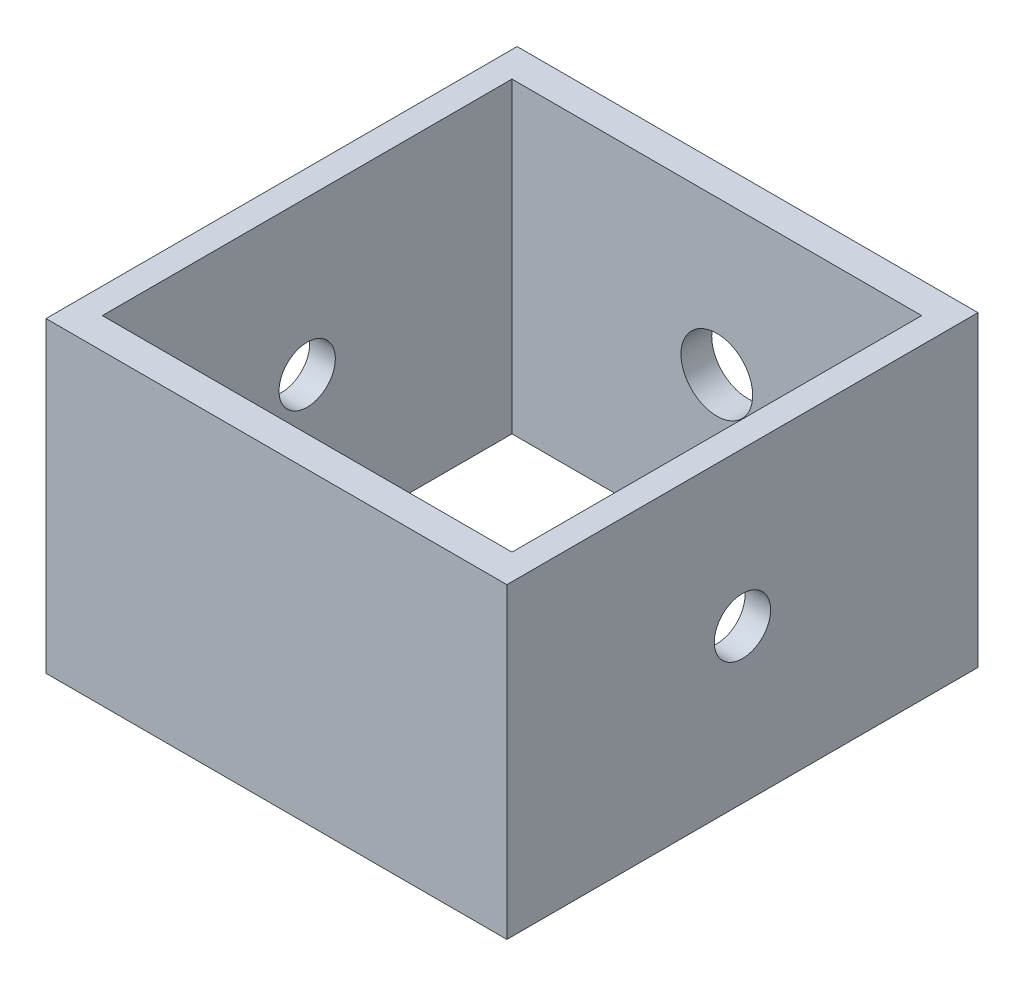
ISO-10303-21;
HEADER;
FILE_DESCRIPTION(('STEP AP214'),'2;1');
FILE_NAME('part.step','',(''),(''),'','','');
FILE_SCHEMA(('AUTOMOTIVE_DESIGN { 1 0 10303 214 1 1 1 1 }'));
ENDSEC;
DATA;
#1=APPLICATION_CONTEXT('core data for automotive mechanical design processes');
#2=APPLICATION_PROTOCOL_DEFINITION('international standard','automotive_design',2000,#1);
#3=PRODUCT_CONTEXT('',#1,'mechanical');
#4=PRODUCT('Part','Part','',(#3));
#5=PRODUCT_RELATED_PRODUCT_CATEGORY('part','',(#4));
#6=PRODUCT_DEFINITION_FORMATION('','',#4);
#7=PRODUCT_DEFINITION_CONTEXT('part definition',#1,'design');
#8=PRODUCT_DEFINITION('design','',#6,#7);
#9=PRODUCT_DEFINITION_SHAPE('','',#8);
#10=(LENGTH_UNIT() NAMED_UNIT(*) SI_UNIT(.MILLI.,.METRE.));
#11=(NAMED_UNIT(*) PLANE_ANGLE_UNIT() SI_UNIT($,.RADIAN.));
#12=(NAMED_UNIT(*) SI_UNIT($,.STERADIAN.) SOLID_ANGLE_UNIT());
#13=UNCERTAINTY_MEASURE_WITH_UNIT(LENGTH_MEASURE(1.E-05),#10,'distance_accuracy_value','');
#14=(GEOMETRIC_REPRESENTATION_CONTEXT(3) GLOBAL_UNCERTAINTY_ASSIGNED_CONTEXT((#13)) GLOBAL_UNIT_ASSIGNED_CONTEXT((#10,
#11,#12)) REPRESENTATION_CONTEXT('',''));
#15=CARTESIAN_POINT('',(0.,0.,0.));
#16=DIRECTION('',(0.,0.,1.));
#17=DIRECTION('',(1.,0.,0.));
#18=AXIS2_PLACEMENT_3D('',#15,#16,#17);
#19=CARTESIAN_POINT('',(-22.5,15.,0.));
#20=DIRECTION('',(1.,0.,0.));
#21=DIRECTION('',(0.,0.,-1.));
#22=AXIS2_PLACEMENT_3D('',#19,#20,#21);
#23=CYLINDRICAL_SURFACE('',#22,2.75);
#24=CARTESIAN_POINT('',(20.,15.,0.));
#25=DIRECTION('',(1.,0.,0.));
#26=DIRECTION('',(0.,0.,-1.));
#27=AXIS2_PLACEMENT_3D('',#24,#25,#26);
#28=CIRCLE('',#27,2.75);
#29=CARTESIAN_POINT('',(20.,15.,-2.75));
#30=VERTEX_POINT('',#29);
#31=EDGE_CURVE('E181',#30,#30,#28,.F.);
#32=CARTESIAN_POINT('',(22.5,15.,0.));
#33=DIRECTION('',(1.,0.,0.));
#34=DIRECTION('',(0.,0.,-1.));
#35=AXIS2_PLACEMENT_3D('',#32,#33,#34);
#36=CIRCLE('',#35,2.75);
#37=CARTESIAN_POINT('',(22.5,15.,-2.75));
#38=VERTEX_POINT('',#37);
#39=EDGE_CURVE('E149',#38,#38,#36,.T.);
#40=CARTESIAN_POINT('',(20.,15.,-2.75));
#41=CARTESIAN_POINT('',(20.0260416666667,15.,-2.75));
#42=CARTESIAN_POINT('',(20.0520833333333,15.,-2.75));
#43=CARTESIAN_POINT('',(20.1041666666667,15.,-2.75));
#44=CARTESIAN_POINT('',(20.1302083333333,15.,-2.75));
#45=CARTESIAN_POINT('',(20.1822916666667,15.,-2.75));
#46=CARTESIAN_POINT('',(20.2083333333333,15.,-2.75));
#47=CARTESIAN_POINT('',(20.2604166666667,15.,-2.75));
#48=CARTESIAN_POINT('',(20.2864583333333,15.,-2.75));
#49=CARTESIAN_POINT('',(20.3385416666667,15.,-2.75));
#50=CARTESIAN_POINT('',(20.3645833333333,15.,-2.75));
#51=CARTESIAN_POINT('',(20.4166666666667,15.,-2.75));
#52=CARTESIAN_POINT('',(20.4427083333333,15.,-2.75));
#53=CARTESIAN_POINT('',(20.4947916666667,15.,-2.75));
#54=CARTESIAN_POINT('',(20.5208333333333,15.,-2.75));
#55=CARTESIAN_POINT('',(20.5729166666667,15.,-2.75));
#56=CARTESIAN_POINT('',(20.5989583333333,15.,-2.75));
#57=CARTESIAN_POINT('',(20.6510416666667,15.,-2.75));
#58=CARTESIAN_POINT('',(20.6770833333333,15.,-2.75));
#59=CARTESIAN_POINT('',(20.7291666666667,15.,-2.75));
#60=CARTESIAN_POINT('',(20.7552083333333,15.,-2.75));
#61=CARTESIAN_POINT('',(20.8072916666667,15.,-2.75));
#62=CARTESIAN_POINT('',(20.8333333333333,15.,-2.75));
#63=CARTESIAN_POINT('',(20.8854166666667,15.,-2.75));
#64=CARTESIAN_POINT('',(20.9114583333333,15.,-2.75));
#65=CARTESIAN_POINT('',(20.9635416666667,15.,-2.75));
#66=CARTESIAN_POINT('',(20.9895833333333,15.,-2.75));
#67=CARTESIAN_POINT('',(21.0416666666667,15.,-2.75));
#68=CARTESIAN_POINT('',(21.0677083333333,15.,-2.75));
#69=CARTESIAN_POINT('',(21.1197916666667,15.,-2.75));
#70=CARTESIAN_POINT('',(21.1458333333333,15.,-2.75));
#71=CARTESIAN_POINT('',(21.1979166666667,15.,-2.75));
#72=CARTESIAN_POINT('',(21.2239583333333,15.,-2.75));
#73=CARTESIAN_POINT('',(21.2760416666667,15.,-2.75));
#74=CARTESIAN_POINT('',(21.3020833333333,15.,-2.75));
#75=CARTESIAN_POINT('',(21.3541666666667,15.,-2.75));
#76=CARTESIAN_POINT('',(21.3802083333333,15.,-2.75));
#77=CARTESIAN_POINT('',(21.4322916666667,15.,-2.75));
#78=CARTESIAN_POINT('',(21.4583333333333,15.,-2.75));
#79=CARTESIAN_POINT('',(21.5104166666667,15.,-2.75));
#80=CARTESIAN_POINT('',(21.5364583333333,15.,-2.75));
#81=CARTESIAN_POINT('',(21.5885416666667,15.,-2.75));
#82=CARTESIAN_POINT('',(21.6145833333333,15.,-2.75));
#83=CARTESIAN_POINT('',(21.6666666666667,15.,-2.75));
#84=CARTESIAN_POINT('',(21.6927083333333,15.,-2.75));
#85=CARTESIAN_POINT('',(21.7447916666667,15.,-2.75));
#86=CARTESIAN_POINT('',(21.7708333333333,15.,-2.75));
#87=CARTESIAN_POINT('',(21.8229166666667,15.,-2.75));
#88=CARTESIAN_POINT('',(21.8489583333333,15.,-2.75));
#89=CARTESIAN_POINT('',(21.9010416666667,15.,-2.75));
#90=CARTESIAN_POINT('',(21.9270833333333,15.,-2.75));
#91=CARTESIAN_POINT('',(21.9791666666667,15.,-2.75));
#92=CARTESIAN_POINT('',(22.0052083333333,15.,-2.75));
#93=CARTESIAN_POINT('',(22.0572916666667,15.,-2.75));
#94=CARTESIAN_POINT('',(22.0833333333333,15.,-2.75));
#95=CARTESIAN_POINT('',(22.1354166666667,15.,-2.75));
#96=CARTESIAN_POINT('',(22.1614583333333,15.,-2.75));
#97=CARTESIAN_POINT('',(22.2135416666667,15.,-2.75));
#98=CARTESIAN_POINT('',(22.2395833333333,15.,-2.75));
#99=CARTESIAN_POINT('',(22.2916666666667,15.,-2.75));
#100=CARTESIAN_POINT('',(22.3177083333333,15.,-2.75));
#101=CARTESIAN_POINT('',(22.3697916666667,15.,-2.75));
#102=CARTESIAN_POINT('',(22.3958333333333,15.,-2.75));
#103=CARTESIAN_POINT('',(22.4479166666667,15.,-2.75));
#104=CARTESIAN_POINT('',(22.4739583333333,15.,-2.75));
#105=CARTESIAN_POINT('',(22.5,15.,-2.75));
#106=B_SPLINE_CURVE_WITH_KNOTS('',3,(#40,#41,#42,#43,#44,#45,#46,#47,#48,#49,#50,#51,#52,#53,
#54,#55,#56,#57,#58,#59,#60,#61,#62,#63,#64,#65,#66,#67,#68,#69,#70,#71,#72,#73,#74,#75,#76,#77,
#78,#79,#80,#81,#82,#83,#84,#85,#86,#87,#88,#89,#90,#91,#92,#93,#94,#95,#96,#97,#98,#99,#100,
#101,#102,#103,#104,#105),.UNSPECIFIED.,.F.,.F.,(4,2,2,2,2,2,2,2,2,2,2,2,2,2,2,2,2,2,2,2,2,2,2,
2,2,2,2,2,2,2,2,2,4),(0.,0.0781249999999983,0.156249999999997,0.234375000000002,0.3125,
0.390624999999999,0.468750000000004,0.546875000000002,0.625000000000001,0.703124999999999,
0.781249999999997,0.859375000000002,0.937500000000001,1.015625,1.09375,1.171875,1.25,1.328125,
1.40625,1.484375,1.5625,1.640625,1.71875,1.796875,1.875,1.953125,2.03125,2.109375,2.1875,
2.265625,2.34375000000001,2.421875,2.5),.UNSPECIFIED.);
#107=EDGE_CURVE('BSEAM39',#30,#38,#106,.T.);
#108=ORIENTED_EDGE('',*,*,#31,.T.);
#109=ORIENTED_EDGE('',*,*,#39,.T.);
#110=ORIENTED_EDGE('',*,*,#107,.T.);
#111=ORIENTED_EDGE('',*,*,#107,.F.);
#112=EDGE_LOOP('',(#108,#110,#109,#111));
#113=FACE_BOUND('',#112,.T.);
#114=ADVANCED_FACE('F39',(#113),#23,.F.);
#115=CARTESIAN_POINT('',(22.5,30.,23.));
#116=DIRECTION('',(-1.,0.,0.));
#117=DIRECTION('',(0.,0.,1.));
#118=AXIS2_PLACEMENT_3D('',#115,#116,#117);
#119=PLANE('',#118);
#120=ORIENTED_EDGE('',*,*,#39,.F.);
#121=EDGE_LOOP('',(#120));
#122=FACE_BOUND('',#121,.T.);
#123=DIRECTION('',(0.,0.,-1.));
#124=VECTOR('',#123,1.);
#125=CARTESIAN_POINT('',(22.5,0.,23.));
#126=LINE('',#125,#124);
#127=CARTESIAN_POINT('',(22.5,0.,23.));
#128=VERTEX_POINT('',#127);
#129=CARTESIAN_POINT('',(22.5,0.,-23.));
#130=VERTEX_POINT('',#129);
#131=EDGE_CURVE('E154',#128,#130,#126,.T.);
#132=ORIENTED_EDGE('',*,*,#131,.T.);
#133=DIRECTION('',(0.,-1.,0.));
#134=VECTOR('',#133,1.);
#135=CARTESIAN_POINT('',(22.5,30.,-23.));
#136=LINE('',#135,#134);
#137=CARTESIAN_POINT('',(22.5,30.,-23.));
#138=VERTEX_POINT('',#137);
#139=EDGE_CURVE('E11',#138,#130,#136,.T.);
#140=ORIENTED_EDGE('',*,*,#139,.F.);
#141=DIRECTION('',(0.,0.,-1.));
#142=VECTOR('',#141,1.);
#143=CARTESIAN_POINT('',(22.5,30.,23.));
#144=LINE('',#143,#142);
#145=CARTESIAN_POINT('',(22.5,30.,23.));
#146=VERTEX_POINT('',#145);
#147=EDGE_CURVE('E155',#146,#138,#144,.T.);
#148=ORIENTED_EDGE('',*,*,#147,.F.);
#149=DIRECTION('',(0.,-1.,0.));
#150=VECTOR('',#149,1.);
#151=CARTESIAN_POINT('',(22.5,30.,23.));
#152=LINE('',#151,#150);
#153=EDGE_CURVE('E165',#146,#128,#152,.T.);
#154=ORIENTED_EDGE('',*,*,#153,.T.);
#155=EDGE_LOOP('',(#132,#140,#148,#154));
#156=FACE_BOUND('',#155,.T.);
#157=ADVANCED_FACE('F41',(#122,#156),#119,.F.);
#158=CARTESIAN_POINT('',(-22.5,30.,-23.));
#159=DIRECTION('',(0.,0.,1.));
#160=DIRECTION('',(1.,0.,0.));
#161=AXIS2_PLACEMENT_3D('',#158,#159,#160);
#162=PLANE('',#161);
#163=CARTESIAN_POINT('',(0.,15.,-23.));
#164=DIRECTION('',(0.,0.,-1.));
#165=DIRECTION('',(-1.,0.,0.));
#166=AXIS2_PLACEMENT_3D('',#163,#164,#165);
#167=CIRCLE('',#166,3.5);
#168=CARTESIAN_POINT('',(-3.49999999999999,15.,-23.));
#169=VERTEX_POINT('',#168);
#170=EDGE_CURVE('E148',#169,#169,#167,.T.);
#171=ORIENTED_EDGE('',*,*,#170,.F.);
#172=EDGE_LOOP('',(#171));
#173=FACE_BOUND('',#172,.T.);
#174=DIRECTION('',(-1.,0.,0.));
#175=VECTOR('',#174,1.);
#176=CARTESIAN_POINT('',(-22.5,0.,-23.));
#177=LINE('',#176,#175);
#178=CARTESIAN_POINT('',(-22.5,0.,-23.));
#179=VERTEX_POINT('',#178);
#180=EDGE_CURVE('E168',#130,#179,#177,.T.);
#181=ORIENTED_EDGE('',*,*,#180,.T.);
#182=DIRECTION('',(0.,-1.,0.));
#183=VECTOR('',#182,1.);
#184=CARTESIAN_POINT('',(-22.5,30.,-23.));
#185=LINE('',#184,#183);
#186=CARTESIAN_POINT('',(-22.5,30.,-23.));
#187=VERTEX_POINT('',#186);
#188=EDGE_CURVE('E48',#187,#179,#185,.T.);
#189=ORIENTED_EDGE('',*,*,#188,.F.);
#190=DIRECTION('',(-1.,0.,0.));
#191=VECTOR('',#190,1.);
#192=CARTESIAN_POINT('',(-22.5,30.,-23.));
#193=LINE('',#192,#191);
#194=EDGE_CURVE('E158',#138,#187,#193,.T.);
#195=ORIENTED_EDGE('',*,*,#194,.F.);
#196=ORIENTED_EDGE('',*,*,#139,.T.);
#197=EDGE_LOOP('',(#181,#189,#195,#196));
#198=FACE_BOUND('',#197,.T.);
#199=ADVANCED_FACE('F206',(#173,#198),#162,.F.);
#200=CARTESIAN_POINT('',(-22.5,30.,23.));
#201=DIRECTION('',(1.,0.,0.));
#202=DIRECTION('',(0.,0.,-1.));
#203=AXIS2_PLACEMENT_3D('',#200,#201,#202);
#204=PLANE('',#203);
#205=CARTESIAN_POINT('',(-22.5,15.,0.));
#206=DIRECTION('',(1.,0.,0.));
#207=DIRECTION('',(0.,0.,-1.));
#208=AXIS2_PLACEMENT_3D('',#205,#206,#207);
#209=CIRCLE('',#208,2.75);
#210=CARTESIAN_POINT('',(-22.5,15.,-2.75));
#211=VERTEX_POINT('',#210);
#212=EDGE_CURVE('E145',#211,#211,#209,.T.);
#213=ORIENTED_EDGE('',*,*,#212,.T.);
#214=EDGE_LOOP('',(#213));
#215=FACE_BOUND('',#214,.T.);
#216=DIRECTION('',(0.,0.,1.));
#217=VECTOR('',#216,1.);
#218=CARTESIAN_POINT('',(-22.5,0.,23.));
#219=LINE('',#218,#217);
#220=CARTESIAN_POINT('',(-22.5,0.,23.));
#221=VERTEX_POINT('',#220);
#222=EDGE_CURVE('E170',#179,#221,#219,.T.);
#223=ORIENTED_EDGE('',*,*,#222,.T.);
#224=DIRECTION('',(0.,-1.,0.));
#225=VECTOR('',#224,1.);
#226=CARTESIAN_POINT('',(-22.5,30.,23.));
#227=LINE('',#226,#225);
#228=CARTESIAN_POINT('',(-22.5,30.,23.));
#229=VERTEX_POINT('',#228);
#230=EDGE_CURVE('E175',#229,#221,#227,.T.);
#231=ORIENTED_EDGE('',*,*,#230,.F.);
#232=DIRECTION('',(0.,0.,1.));
#233=VECTOR('',#232,1.);
#234=CARTESIAN_POINT('',(-22.5,30.,23.));
#235=LINE('',#234,#233);
#236=EDGE_CURVE('E161',#187,#229,#235,.T.);
#237=ORIENTED_EDGE('',*,*,#236,.F.);
#238=ORIENTED_EDGE('',*,*,#188,.T.);
#239=EDGE_LOOP('',(#223,#231,#237,#238));
#240=FACE_BOUND('',#239,.T.);
#241=ADVANCED_FACE('F221',(#215,#240),#204,.F.);
#242=CARTESIAN_POINT('',(-22.5,30.,23.));
#243=DIRECTION('',(0.,0.,-1.));
#244=DIRECTION('',(-1.,0.,0.));
#245=AXIS2_PLACEMENT_3D('',#242,#243,#244);
#246=PLANE('',#245);
#247=DIRECTION('',(1.,0.,0.));
#248=VECTOR('',#247,1.);
#249=CARTESIAN_POINT('',(-22.5,0.,23.));
#250=LINE('',#249,#248);
#251=EDGE_CURVE('E159',#221,#128,#250,.T.);
#252=ORIENTED_EDGE('',*,*,#251,.T.);
#253=ORIENTED_EDGE('',*,*,#153,.F.);
#254=DIRECTION('',(1.,0.,0.));
#255=VECTOR('',#254,1.);
#256=CARTESIAN_POINT('',(-22.5,30.,23.));
#257=LINE('',#256,#255);
#258=EDGE_CURVE('E163',#229,#146,#257,.T.);
#259=ORIENTED_EDGE('',*,*,#258,.F.);
#260=ORIENTED_EDGE('',*,*,#230,.T.);
#261=EDGE_LOOP('',(#252,#253,#259,#260));
#262=FACE_BOUND('',#261,.T.);
#263=ADVANCED_FACE('F215',(#262),#246,.F.);
#264=CARTESIAN_POINT('',(0.,30.,0.));
#265=DIRECTION('',(0.,-1.,0.));
#266=DIRECTION('',(0.,0.,-1.));
#267=AXIS2_PLACEMENT_3D('',#264,#265,#266);
#268=PLANE('',#267);
#269=DIRECTION('',(-1.,0.,0.));
#270=VECTOR('',#269,1.);
#271=CARTESIAN_POINT('',(-20.,30.,-20.));
#272=LINE('',#271,#270);
#273=CARTESIAN_POINT('',(20.,30.,-20.));
#274=VERTEX_POINT('',#273);
#275=CARTESIAN_POINT('',(-20.,30.,-20.));
#276=VERTEX_POINT('',#275);
#277=EDGE_CURVE('E135',#274,#276,#272,.T.);
#278=ORIENTED_EDGE('',*,*,#277,.F.);
#279=DIRECTION('',(0.,0.,-1.));
#280=VECTOR('',#279,1.);
#281=CARTESIAN_POINT('',(20.,30.,20.));
#282=LINE('',#281,#280);
#283=CARTESIAN_POINT('',(20.,30.,20.));
#284=VERTEX_POINT('',#283);
#285=EDGE_CURVE('E56',#284,#274,#282,.T.);
#286=ORIENTED_EDGE('',*,*,#285,.F.);
#287=DIRECTION('',(1.,0.,0.));
#288=VECTOR('',#287,1.);
#289=CARTESIAN_POINT('',(-20.,30.,20.));
#290=LINE('',#289,#288);
#291=CARTESIAN_POINT('',(-20.,30.,20.));
#292=VERTEX_POINT('',#291);
#293=EDGE_CURVE('E126',#292,#284,#290,.T.);
#294=ORIENTED_EDGE('',*,*,#293,.F.);
#295=DIRECTION('',(0.,0.,1.));
#296=VECTOR('',#295,1.);
#297=CARTESIAN_POINT('',(-20.,30.,20.));
#298=LINE('',#297,#296);
#299=EDGE_CURVE('E129',#276,#292,#298,.T.);
#300=ORIENTED_EDGE('',*,*,#299,.F.);
#301=EDGE_LOOP('',(#278,#286,#294,#300));
#302=FACE_BOUND('',#301,.T.);
#303=ORIENTED_EDGE('',*,*,#147,.T.);
#304=ORIENTED_EDGE('',*,*,#194,.T.);
#305=ORIENTED_EDGE('',*,*,#236,.T.);
#306=ORIENTED_EDGE('',*,*,#258,.T.);
#307=EDGE_LOOP('',(#303,#304,#305,#306));
#308=FACE_BOUND('',#307,.T.);
#309=ADVANCED_FACE('F212',(#302,#308),#268,.F.);
#310=CARTESIAN_POINT('',(0.,0.,0.));
#311=DIRECTION('',(0.,-1.,0.));
#312=DIRECTION('',(0.,0.,-1.));
#313=AXIS2_PLACEMENT_3D('',#310,#311,#312);
#314=PLANE('',#313);
#315=DIRECTION('',(0.,0.,-1.));
#316=VECTOR('',#315,1.);
#317=CARTESIAN_POINT('',(20.,0.,20.));
#318=LINE('',#317,#316);
#319=CARTESIAN_POINT('',(20.,0.,20.));
#320=VERTEX_POINT('',#319);
#321=CARTESIAN_POINT('',(20.,0.,-20.));
#322=VERTEX_POINT('',#321);
#323=EDGE_CURVE('E109',#320,#322,#318,.T.);
#324=ORIENTED_EDGE('',*,*,#323,.T.);
#325=DIRECTION('',(-1.,0.,0.));
#326=VECTOR('',#325,1.);
#327=CARTESIAN_POINT('',(-20.,0.,-20.));
#328=LINE('',#327,#326);
#329=CARTESIAN_POINT('',(-20.,0.,-20.));
#330=VERTEX_POINT('',#329);
#331=EDGE_CURVE('E118',#322,#330,#328,.T.);
#332=ORIENTED_EDGE('',*,*,#331,.T.);
#333=DIRECTION('',(0.,0.,1.));
#334=VECTOR('',#333,1.);
#335=CARTESIAN_POINT('',(-20.,0.,20.));
#336=LINE('',#335,#334);
#337=CARTESIAN_POINT('',(-20.,0.,20.));
#338=VERTEX_POINT('',#337);
#339=EDGE_CURVE('E64',#330,#338,#336,.T.);
#340=ORIENTED_EDGE('',*,*,#339,.T.);
#341=DIRECTION('',(1.,0.,0.));
#342=VECTOR('',#341,1.);
#343=CARTESIAN_POINT('',(-20.,0.,20.));
#344=LINE('',#343,#342);
#345=EDGE_CURVE('E115',#338,#320,#344,.T.);
#346=ORIENTED_EDGE('',*,*,#345,.T.);
#347=EDGE_LOOP('',(#324,#332,#340,#346));
#348=FACE_BOUND('',#347,.T.);
#349=ORIENTED_EDGE('',*,*,#131,.F.);
#350=ORIENTED_EDGE('',*,*,#251,.F.);
#351=ORIENTED_EDGE('',*,*,#222,.F.);
#352=ORIENTED_EDGE('',*,*,#180,.F.);
#353=EDGE_LOOP('',(#349,#350,#351,#352));
#354=FACE_BOUND('',#353,.T.);
#355=ADVANCED_FACE('F123',(#348,#354),#314,.T.);
#356=CARTESIAN_POINT('',(0.,15.,-13.));
#357=DIRECTION('',(0.,0.,-1.));
#358=DIRECTION('',(-1.,0.,0.));
#359=AXIS2_PLACEMENT_3D('',#356,#357,#358);
#360=CYLINDRICAL_SURFACE('',#359,3.5);
#361=CARTESIAN_POINT('',(0.,15.,-20.));
#362=DIRECTION('',(0.,0.,-1.));
#363=DIRECTION('',(-1.,0.,0.));
#364=AXIS2_PLACEMENT_3D('',#361,#362,#363);
#365=CIRCLE('',#364,3.5);
#366=CARTESIAN_POINT('',(-3.49999999999999,15.,-20.));
#367=VERTEX_POINT('',#366);
#368=EDGE_CURVE('E43',#367,#367,#365,.F.);
#369=ORIENTED_EDGE('',*,*,#368,.T.);
#370=EDGE_LOOP('',(#369));
#371=FACE_BOUND('',#370,.T.);
#372=ORIENTED_EDGE('',*,*,#170,.T.);
#373=EDGE_LOOP('',(#372));
#374=FACE_BOUND('',#373,.T.);
#375=ADVANCED_FACE('F188',(#371,#374),#360,.F.);
#376=CARTESIAN_POINT('',(-20.,15.,0.));
#377=DIRECTION('',(-1.,0.,0.));
#378=DIRECTION('',(0.,0.,1.));
#379=AXIS2_PLACEMENT_3D('',#376,#377,#378);
#380=CIRCLE('',#379,2.75);
#381=CARTESIAN_POINT('',(-20.,15.,-2.75));
#382=VERTEX_POINT('',#381);
#383=EDGE_CURVE('E141',#382,#382,#380,.F.);
#384=CARTESIAN_POINT('',(-20.,15.,-2.75));
#385=CARTESIAN_POINT('',(-20.0260416666667,15.,-2.75));
#386=CARTESIAN_POINT('',(-20.0520833333333,15.,-2.75));
#387=CARTESIAN_POINT('',(-20.1041666666667,15.,-2.75));
#388=CARTESIAN_POINT('',(-20.1302083333333,15.,-2.75));
#389=CARTESIAN_POINT('',(-20.1822916666667,15.,-2.75));
#390=CARTESIAN_POINT('',(-20.2083333333333,15.,-2.75));
#391=CARTESIAN_POINT('',(-20.2604166666667,15.,-2.75));
#392=CARTESIAN_POINT('',(-20.2864583333333,15.,-2.75));
#393=CARTESIAN_POINT('',(-20.3385416666667,15.,-2.75));
#394=CARTESIAN_POINT('',(-20.3645833333333,15.,-2.75));
#395=CARTESIAN_POINT('',(-20.4166666666667,15.,-2.75));
#396=CARTESIAN_POINT('',(-20.4427083333333,15.,-2.75));
#397=CARTESIAN_POINT('',(-20.4947916666667,15.,-2.75));
#398=CARTESIAN_POINT('',(-20.5208333333333,15.,-2.75));
#399=CARTESIAN_POINT('',(-20.5729166666667,15.,-2.75));
#400=CARTESIAN_POINT('',(-20.5989583333333,15.,-2.75));
#401=CARTESIAN_POINT('',(-20.6510416666667,15.,-2.75));
#402=CARTESIAN_POINT('',(-20.6770833333333,15.,-2.75));
#403=CARTESIAN_POINT('',(-20.7291666666667,15.,-2.75));
#404=CARTESIAN_POINT('',(-20.7552083333333,15.,-2.75));
#405=CARTESIAN_POINT('',(-20.8072916666667,15.,-2.75));
#406=CARTESIAN_POINT('',(-20.8333333333333,15.,-2.75));
#407=CARTESIAN_POINT('',(-20.8854166666667,15.,-2.75));
#408=CARTESIAN_POINT('',(-20.9114583333333,15.,-2.75));
#409=CARTESIAN_POINT('',(-20.9635416666667,15.,-2.75));
#410=CARTESIAN_POINT('',(-20.9895833333333,15.,-2.75));
#411=CARTESIAN_POINT('',(-21.0416666666667,15.,-2.75));
#412=CARTESIAN_POINT('',(-21.0677083333333,15.,-2.75));
#413=CARTESIAN_POINT('',(-21.1197916666667,15.,-2.75));
#414=CARTESIAN_POINT('',(-21.1458333333333,15.,-2.75));
#415=CARTESIAN_POINT('',(-21.1979166666667,15.,-2.75));
#416=CARTESIAN_POINT('',(-21.2239583333333,15.,-2.75));
#417=CARTESIAN_POINT('',(-21.2760416666667,15.,-2.75));
#418=CARTESIAN_POINT('',(-21.3020833333333,15.,-2.75));
#419=CARTESIAN_POINT('',(-21.3541666666667,15.,-2.75));
#420=CARTESIAN_POINT('',(-21.3802083333333,15.,-2.75));
#421=CARTESIAN_POINT('',(-21.4322916666667,15.,-2.75));
#422=CARTESIAN_POINT('',(-21.4583333333333,15.,-2.75));
#423=CARTESIAN_POINT('',(-21.5104166666667,15.,-2.75));
#424=CARTESIAN_POINT('',(-21.5364583333333,15.,-2.75));
#425=CARTESIAN_POINT('',(-21.5885416666667,15.,-2.75));
#426=CARTESIAN_POINT('',(-21.6145833333333,15.,-2.75));
#427=CARTESIAN_POINT('',(-21.6666666666667,15.,-2.75));
#428=CARTESIAN_POINT('',(-21.6927083333333,15.,-2.75));
#429=CARTESIAN_POINT('',(-21.7447916666667,15.,-2.75));
#430=CARTESIAN_POINT('',(-21.7708333333333,15.,-2.75));
#431=CARTESIAN_POINT('',(-21.8229166666667,15.,-2.75));
#432=CARTESIAN_POINT('',(-21.8489583333333,15.,-2.75));
#433=CARTESIAN_POINT('',(-21.9010416666667,15.,-2.75));
#434=CARTESIAN_POINT('',(-21.9270833333333,15.,-2.75));
#435=CARTESIAN_POINT('',(-21.9791666666667,15.,-2.75));
#436=CARTESIAN_POINT('',(-22.0052083333333,15.,-2.75));
#437=CARTESIAN_POINT('',(-22.0572916666667,15.,-2.75));
#438=CARTESIAN_POINT('',(-22.0833333333333,15.,-2.75));
#439=CARTESIAN_POINT('',(-22.1354166666667,15.,-2.75));
#440=CARTESIAN_POINT('',(-22.1614583333333,15.,-2.75));
#441=CARTESIAN_POINT('',(-22.2135416666667,15.,-2.75));
#442=CARTESIAN_POINT('',(-22.2395833333333,15.,-2.75));
#443=CARTESIAN_POINT('',(-22.2916666666667,15.,-2.75));
#444=CARTESIAN_POINT('',(-22.3177083333333,15.,-2.75));
#445=CARTESIAN_POINT('',(-22.3697916666667,15.,-2.75));
#446=CARTESIAN_POINT('',(-22.3958333333333,15.,-2.75));
#447=CARTESIAN_POINT('',(-22.4479166666667,15.,-2.75));
#448=CARTESIAN_POINT('',(-22.4739583333333,15.,-2.75));
#449=CARTESIAN_POINT('',(-22.5,15.,-2.75));
#450=B_SPLINE_CURVE_WITH_KNOTS('',3,(#384,#385,#386,#387,#388,#389,#390,#391,#392,#393,#394,
#395,#396,#397,#398,#399,#400,#401,#402,#403,#404,#405,#406,#407,#408,#409,#410,#411,#412,#413,
#414,#415,#416,#417,#418,#419,#420,#421,#422,#423,#424,#425,#426,#427,#428,#429,#430,#431,#432,
#433,#434,#435,#436,#437,#438,#439,#440,#441,#442,#443,#444,#445,#446,#447,#448,#449),
.UNSPECIFIED.,.F.,.F.,(4,2,2,2,2,2,2,2,2,2,2,2,2,2,2,2,2,2,2,2,2,2,2,2,2,2,2,2,2,2,2,2,4),(0.,
0.0781250000000018,0.15625,0.234375000000002,0.3125,0.390625000000002,0.46875,0.546875000000002,
0.625000000000001,0.703125000000002,0.781250000000001,0.859375000000002,0.937500000000001,
1.015625,1.09375,1.171875,1.25,1.328125,1.40625,1.484375,1.5625,1.640625,1.71875,1.796875,1.875,
1.953125,2.03125,2.109375,2.1875,2.265625,2.34375,2.421875,2.5),.UNSPECIFIED.);
#451=EDGE_CURVE('BSEAM191',#382,#211,#450,.T.);
#452=ORIENTED_EDGE('',*,*,#383,.T.);
#453=ORIENTED_EDGE('',*,*,#212,.F.);
#454=ORIENTED_EDGE('',*,*,#451,.T.);
#455=ORIENTED_EDGE('',*,*,#451,.F.);
#456=EDGE_LOOP('',(#452,#454,#453,#455));
#457=FACE_BOUND('',#456,.T.);
#458=ADVANCED_FACE('F191',(#457),#23,.F.);
#459=CARTESIAN_POINT('',(-20.,0.,-20.));
#460=DIRECTION('',(0.,0.,-1.));
#461=DIRECTION('',(-1.,0.,0.));
#462=AXIS2_PLACEMENT_3D('',#459,#460,#461);
#463=PLANE('',#462);
#464=ORIENTED_EDGE('',*,*,#277,.T.);
#465=DIRECTION('',(0.,1.,0.));
#466=VECTOR('',#465,1.);
#467=CARTESIAN_POINT('',(-20.,0.,-20.));
#468=LINE('',#467,#466);
#469=EDGE_CURVE('E114',#330,#276,#468,.T.);
#470=ORIENTED_EDGE('',*,*,#469,.F.);
#471=ORIENTED_EDGE('',*,*,#331,.F.);
#472=DIRECTION('',(0.,1.,0.));
#473=VECTOR('',#472,1.);
#474=CARTESIAN_POINT('',(20.,0.,-20.));
#475=LINE('',#474,#473);
#476=EDGE_CURVE('E104',#322,#274,#475,.T.);
#477=ORIENTED_EDGE('',*,*,#476,.T.);
#478=EDGE_LOOP('',(#464,#470,#471,#477));
#479=FACE_BOUND('',#478,.T.);
#480=ORIENTED_EDGE('',*,*,#368,.F.);
#481=EDGE_LOOP('',(#480));
#482=FACE_BOUND('',#481,.T.);
#483=ADVANCED_FACE('F119',(#479,#482),#463,.F.);
#484=CARTESIAN_POINT('',(20.,0.,20.));
#485=DIRECTION('',(1.,0.,0.));
#486=DIRECTION('',(0.,0.,-1.));
#487=AXIS2_PLACEMENT_3D('',#484,#485,#486);
#488=PLANE('',#487);
#489=ORIENTED_EDGE('',*,*,#285,.T.);
#490=ORIENTED_EDGE('',*,*,#476,.F.);
#491=ORIENTED_EDGE('',*,*,#323,.F.);
#492=DIRECTION('',(0.,1.,0.));
#493=VECTOR('',#492,1.);
#494=CARTESIAN_POINT('',(20.,0.,20.));
#495=LINE('',#494,#493);
#496=EDGE_CURVE('E139',#320,#284,#495,.T.);
#497=ORIENTED_EDGE('',*,*,#496,.T.);
#498=EDGE_LOOP('',(#489,#490,#491,#497));
#499=FACE_BOUND('',#498,.T.);
#500=ORIENTED_EDGE('',*,*,#31,.F.);
#501=EDGE_LOOP('',(#500));
#502=FACE_BOUND('',#501,.T.);
#503=ADVANCED_FACE('F106',(#499,#502),#488,.F.);
#504=CARTESIAN_POINT('',(-20.,0.,20.));
#505=DIRECTION('',(-1.,0.,0.));
#506=DIRECTION('',(0.,0.,1.));
#507=AXIS2_PLACEMENT_3D('',#504,#505,#506);
#508=PLANE('',#507);
#509=ORIENTED_EDGE('',*,*,#299,.T.);
#510=DIRECTION('',(0.,1.,0.));
#511=VECTOR('',#510,1.);
#512=CARTESIAN_POINT('',(-20.,0.,20.));
#513=LINE('',#512,#511);
#514=EDGE_CURVE('E142',#338,#292,#513,.T.);
#515=ORIENTED_EDGE('',*,*,#514,.F.);
#516=ORIENTED_EDGE('',*,*,#339,.F.);
#517=ORIENTED_EDGE('',*,*,#469,.T.);
#518=EDGE_LOOP('',(#509,#515,#516,#517));
#519=FACE_BOUND('',#518,.T.);
#520=ORIENTED_EDGE('',*,*,#383,.F.);
#521=EDGE_LOOP('',(#520));
#522=FACE_BOUND('',#521,.T.);
#523=ADVANCED_FACE('F197',(#519,#522),#508,.F.);
#524=CARTESIAN_POINT('',(-20.,0.,20.));
#525=DIRECTION('',(0.,0.,1.));
#526=DIRECTION('',(1.,0.,0.));
#527=AXIS2_PLACEMENT_3D('',#524,#525,#526);
#528=PLANE('',#527);
#529=ORIENTED_EDGE('',*,*,#293,.T.);
#530=ORIENTED_EDGE('',*,*,#496,.F.);
#531=ORIENTED_EDGE('',*,*,#345,.F.);
#532=ORIENTED_EDGE('',*,*,#514,.T.);
#533=EDGE_LOOP('',(#529,#530,#531,#532));
#534=FACE_BOUND('',#533,.T.);
#535=ADVANCED_FACE('F293',(#534),#528,.F.);
#536=CLOSED_SHELL('',(#114,#157,#199,#241,#263,#309,#355,#375,#458,#483,#503,#523,#535));
#537=MANIFOLD_SOLID_BREP('B2',#536);
#538=ADVANCED_BREP_SHAPE_REPRESENTATION('',(#18,#537),#14);
#539=SHAPE_DEFINITION_REPRESENTATION(#9,#538);
ENDSEC;
END-ISO-10303-21;
